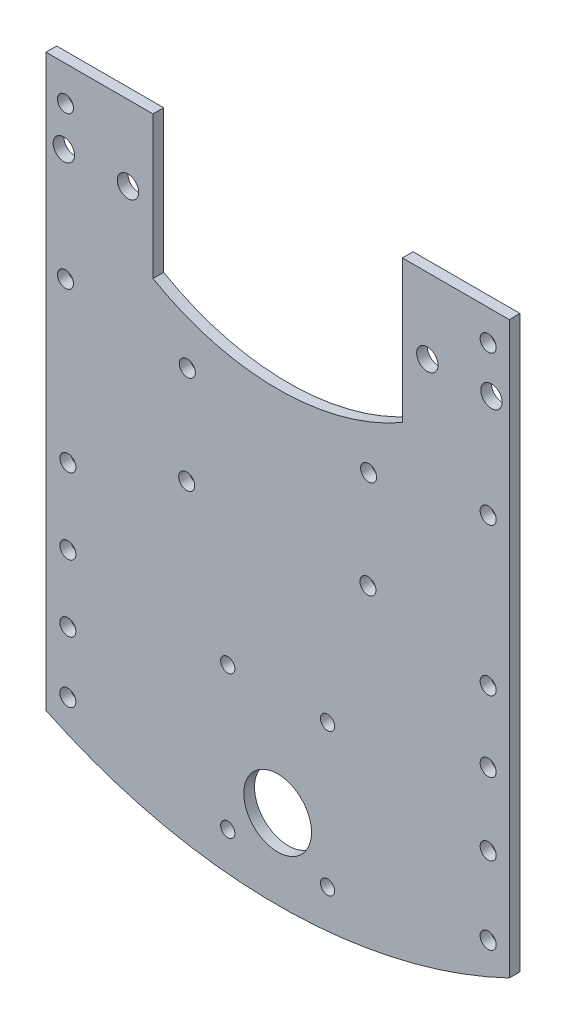
ISO-10303-21;
HEADER;
FILE_DESCRIPTION(('STEP AP214'),'2;1');
FILE_NAME('part.step','',(''),(''),'','','');
FILE_SCHEMA(('AUTOMOTIVE_DESIGN { 1 0 10303 214 1 1 1 1 }'));
ENDSEC;
DATA;
#1=APPLICATION_CONTEXT('core data for automotive mechanical design processes');
#2=APPLICATION_PROTOCOL_DEFINITION('international standard','automotive_design',2000,#1);
#3=PRODUCT_CONTEXT('',#1,'mechanical');
#4=PRODUCT('Part','Part','',(#3));
#5=PRODUCT_RELATED_PRODUCT_CATEGORY('part','',(#4));
#6=PRODUCT_DEFINITION_FORMATION('','',#4);
#7=PRODUCT_DEFINITION_CONTEXT('part definition',#1,'design');
#8=PRODUCT_DEFINITION('design','',#6,#7);
#9=PRODUCT_DEFINITION_SHAPE('','',#8);
#10=(LENGTH_UNIT() NAMED_UNIT(*) SI_UNIT(.MILLI.,.METRE.));
#11=(NAMED_UNIT(*) PLANE_ANGLE_UNIT() SI_UNIT($,.RADIAN.));
#12=(NAMED_UNIT(*) SI_UNIT($,.STERADIAN.) SOLID_ANGLE_UNIT());
#13=UNCERTAINTY_MEASURE_WITH_UNIT(LENGTH_MEASURE(1.E-05),#10,'distance_accuracy_value','');
#14=(GEOMETRIC_REPRESENTATION_CONTEXT(3) GLOBAL_UNCERTAINTY_ASSIGNED_CONTEXT((#13)) GLOBAL_UNIT_ASSIGNED_CONTEXT((#10,
#11,#12)) REPRESENTATION_CONTEXT('',''));
#15=CARTESIAN_POINT('',(0.,0.,0.));
#16=DIRECTION('',(0.,0.,1.));
#17=DIRECTION('',(1.,0.,0.));
#18=AXIS2_PLACEMENT_3D('',#15,#16,#17);
#19=CARTESIAN_POINT('',(0.82033483000224,16.841601103084,3.));
#20=DIRECTION('',(0.,0.,1.));
#21=DIRECTION('',(1.,0.,0.));
#22=AXIS2_PLACEMENT_3D('',#19,#20,#21);
#23=PLANE('',#22);
#24=CARTESIAN_POINT('',(-58.7353248928425,31.901332055439,3.));
#25=DIRECTION('',(0.,0.,1.));
#26=DIRECTION('',(1.,0.,0.));
#27=AXIS2_PLACEMENT_3D('',#24,#25,#26);
#28=CIRCLE('',#27,2.25);
#29=CARTESIAN_POINT('',(-56.4853248928425,31.901332055439,3.));
#30=VERTEX_POINT('',#29);
#31=EDGE_CURVE('E492',#30,#30,#28,.T.);
#32=ORIENTED_EDGE('',*,*,#31,.F.);
#33=EDGE_LOOP('',(#32));
#34=FACE_BOUND('',#33,.T.);
#35=CARTESIAN_POINT('',(59.8926878247371,-112.115366711053,3.));
#36=DIRECTION('',(0.,0.,1.));
#37=DIRECTION('',(1.,0.,0.));
#38=AXIS2_PLACEMENT_3D('',#35,#36,#37);
#39=CIRCLE('',#38,2.25);
#40=CARTESIAN_POINT('',(62.1426878247371,-112.115366711053,3.));
#41=VERTEX_POINT('',#40);
#42=EDGE_CURVE('E500',#41,#41,#39,.T.);
#43=ORIENTED_EDGE('',*,*,#42,.F.);
#44=EDGE_LOOP('',(#43));
#45=FACE_BOUND('',#44,.T.);
#46=CARTESIAN_POINT('',(59.8926878247371,-90.4055847690872,3.));
#47=DIRECTION('',(0.,0.,1.));
#48=DIRECTION('',(1.,0.,0.));
#49=AXIS2_PLACEMENT_3D('',#46,#47,#48);
#50=CIRCLE('',#49,2.25);
#51=CARTESIAN_POINT('',(62.1426878247371,-90.4055847690872,3.));
#52=VERTEX_POINT('',#51);
#53=EDGE_CURVE('E503',#52,#52,#50,.T.);
#54=ORIENTED_EDGE('',*,*,#53,.F.);
#55=EDGE_LOOP('',(#54));
#56=FACE_BOUND('',#55,.T.);
#57=CARTESIAN_POINT('',(59.8926878247371,-70.121992881703,3.));
#58=DIRECTION('',(0.,0.,1.));
#59=DIRECTION('',(1.,0.,0.));
#60=AXIS2_PLACEMENT_3D('',#57,#58,#59);
#61=CIRCLE('',#60,2.25);
#62=CARTESIAN_POINT('',(62.1426878247371,-70.121992881703,3.));
#63=VERTEX_POINT('',#62);
#64=EDGE_CURVE('E506',#63,#63,#61,.T.);
#65=ORIENTED_EDGE('',*,*,#64,.F.);
#66=EDGE_LOOP('',(#65));
#67=FACE_BOUND('',#66,.T.);
#68=CARTESIAN_POINT('',(-58.7353248928425,-10.7596293906167,3.));
#69=DIRECTION('',(0.,0.,1.));
#70=DIRECTION('',(1.,0.,0.));
#71=AXIS2_PLACEMENT_3D('',#68,#69,#70);
#72=CIRCLE('',#71,2.24999999999999);
#73=CARTESIAN_POINT('',(-56.4853248928425,-10.7596293906167,3.));
#74=VERTEX_POINT('',#73);
#75=EDGE_CURVE('E488',#74,#74,#72,.T.);
#76=ORIENTED_EDGE('',*,*,#75,.F.);
#77=EDGE_LOOP('',(#76));
#78=FACE_BOUND('',#77,.T.);
#79=CARTESIAN_POINT('',(-58.0507536666432,-55.0285686848329,3.));
#80=DIRECTION('',(0.,0.,1.));
#81=DIRECTION('',(1.,0.,0.));
#82=AXIS2_PLACEMENT_3D('',#79,#80,#81);
#83=CIRCLE('',#82,2.24999999999999);
#84=CARTESIAN_POINT('',(-55.8007536666432,-55.0285686848329,3.));
#85=VERTEX_POINT('',#84);
#86=EDGE_CURVE('E491',#85,#85,#83,.T.);
#87=ORIENTED_EDGE('',*,*,#86,.F.);
#88=EDGE_LOOP('',(#87));
#89=FACE_BOUND('',#88,.T.);
#90=CARTESIAN_POINT('',(-58.0507536666432,-76.2502766970087,3.));
#91=DIRECTION('',(0.,0.,1.));
#92=DIRECTION('',(1.,0.,0.));
#93=AXIS2_PLACEMENT_3D('',#90,#91,#92);
#94=CIRCLE('',#93,2.25);
#95=CARTESIAN_POINT('',(-55.8007536666432,-76.2502766970087,3.));
#96=VERTEX_POINT('',#95);
#97=EDGE_CURVE('E495',#96,#96,#94,.T.);
#98=ORIENTED_EDGE('',*,*,#97,.F.);
#99=EDGE_LOOP('',(#98));
#100=FACE_BOUND('',#99,.T.);
#101=CARTESIAN_POINT('',(-58.0507536666432,-94.9618902131206,3.));
#102=DIRECTION('',(0.,0.,1.));
#103=DIRECTION('',(1.,0.,0.));
#104=AXIS2_PLACEMENT_3D('',#101,#102,#103);
#105=CIRCLE('',#104,2.24999999999999);
#106=CARTESIAN_POINT('',(-55.8007536666432,-94.9618902131206,3.));
#107=VERTEX_POINT('',#106);
#108=EDGE_CURVE('E487',#107,#107,#105,.T.);
#109=ORIENTED_EDGE('',*,*,#108,.F.);
#110=EDGE_LOOP('',(#109));
#111=FACE_BOUND('',#110,.T.);
#112=CARTESIAN_POINT('',(59.8926878247371,-50.255835401353,3.));
#113=DIRECTION('',(0.,0.,1.));
#114=DIRECTION('',(1.,0.,0.));
#115=AXIS2_PLACEMENT_3D('',#112,#113,#114);
#116=CIRCLE('',#115,2.25);
#117=CARTESIAN_POINT('',(62.1426878247371,-50.255835401353,3.));
#118=VERTEX_POINT('',#117);
#119=EDGE_CURVE('E412',#118,#118,#116,.T.);
#120=ORIENTED_EDGE('',*,*,#119,.F.);
#121=EDGE_LOOP('',(#120));
#122=FACE_BOUND('',#121,.T.);
#123=CARTESIAN_POINT('',(59.8926878247371,-8.82591075219494,3.));
#124=DIRECTION('',(0.,0.,1.));
#125=DIRECTION('',(1.,0.,0.));
#126=AXIS2_PLACEMENT_3D('',#123,#124,#125);
#127=CIRCLE('',#126,2.25);
#128=CARTESIAN_POINT('',(62.1426878247371,-8.82591075219494,3.));
#129=VERTEX_POINT('',#128);
#130=EDGE_CURVE('E514',#129,#129,#127,.T.);
#131=ORIENTED_EDGE('',*,*,#130,.F.);
#132=EDGE_LOOP('',(#131));
#133=FACE_BOUND('',#132,.T.);
#134=CARTESIAN_POINT('',(59.8926878247371,33.0331101704914,3.));
#135=DIRECTION('',(0.,0.,1.));
#136=DIRECTION('',(1.,0.,0.));
#137=AXIS2_PLACEMENT_3D('',#134,#135,#136);
#138=CIRCLE('',#137,2.25);
#139=CARTESIAN_POINT('',(62.1426878247371,33.0331101704914,3.));
#140=VERTEX_POINT('',#139);
#141=EDGE_CURVE('E511',#140,#140,#138,.T.);
#142=ORIENTED_EDGE('',*,*,#141,.F.);
#143=EDGE_LOOP('',(#142));
#144=FACE_BOUND('',#143,.T.);
#145=CARTESIAN_POINT('',(-58.0507536666432,-112.076170868101,3.));
#146=DIRECTION('',(0.,0.,1.));
#147=DIRECTION('',(1.,0.,0.));
#148=AXIS2_PLACEMENT_3D('',#145,#146,#147);
#149=CIRCLE('',#148,2.24999999999999);
#150=CARTESIAN_POINT('',(-55.8007536666432,-112.076170868101,3.));
#151=VERTEX_POINT('',#150);
#152=EDGE_CURVE('E168',#151,#151,#149,.T.);
#153=ORIENTED_EDGE('',*,*,#152,.F.);
#154=EDGE_LOOP('',(#153));
#155=FACE_BOUND('',#154,.T.);
#156=CARTESIAN_POINT('',(-24.6990644063407,-42.8702786135747,3.));
#157=DIRECTION('',(0.,0.,1.));
#158=DIRECTION('',(1.,0.,0.));
#159=AXIS2_PLACEMENT_3D('',#156,#157,#158);
#160=CIRCLE('',#159,2.25);
#161=CARTESIAN_POINT('',(-22.4490644063407,-42.8702786135747,3.));
#162=VERTEX_POINT('',#161);
#163=EDGE_CURVE('E203',#162,#162,#160,.F.);
#164=ORIENTED_EDGE('',*,*,#163,.T.);
#165=EDGE_LOOP('',(#164));
#166=FACE_BOUND('',#165,.T.);
#167=CARTESIAN_POINT('',(-24.52945484201,-15.2902786135747,3.));
#168=DIRECTION('',(0.,0.,1.));
#169=DIRECTION('',(1.,0.,0.));
#170=AXIS2_PLACEMENT_3D('',#167,#168,#169);
#171=CIRCLE('',#170,2.25);
#172=CARTESIAN_POINT('',(-22.27945484201,-15.2902786135747,3.));
#173=VERTEX_POINT('',#172);
#174=EDGE_CURVE('E211',#173,#173,#171,.F.);
#175=ORIENTED_EDGE('',*,*,#174,.T.);
#176=EDGE_LOOP('',(#175));
#177=FACE_BOUND('',#176,.T.);
#178=CARTESIAN_POINT('',(26.3397340663453,-15.2902786135748,3.));
#179=DIRECTION('',(0.,0.,1.));
#180=DIRECTION('',(1.,0.,0.));
#181=AXIS2_PLACEMENT_3D('',#178,#179,#180);
#182=CIRCLE('',#181,2.25);
#183=CARTESIAN_POINT('',(28.5897340663453,-15.2902786135748,3.));
#184=VERTEX_POINT('',#183);
#185=EDGE_CURVE('E218',#184,#184,#182,.F.);
#186=ORIENTED_EDGE('',*,*,#185,.T.);
#187=EDGE_LOOP('',(#186));
#188=FACE_BOUND('',#187,.T.);
#189=CARTESIAN_POINT('',(26.1701245020146,-42.8702786135748,3.));
#190=DIRECTION('',(0.,0.,1.));
#191=DIRECTION('',(1.,0.,0.));
#192=AXIS2_PLACEMENT_3D('',#189,#190,#191);
#193=CIRCLE('',#192,2.25);
#194=CARTESIAN_POINT('',(28.4201245020146,-42.8702786135748,3.));
#195=VERTEX_POINT('',#194);
#196=EDGE_CURVE('E217',#195,#195,#193,.F.);
#197=ORIENTED_EDGE('',*,*,#196,.T.);
#198=EDGE_LOOP('',(#197));
#199=FACE_BOUND('',#198,.T.);
#200=CARTESIAN_POINT('',(-13.1796651699263,-121.721678977984,3.));
#201=DIRECTION('',(0.,0.,1.));
#202=DIRECTION('',(1.,0.,0.));
#203=AXIS2_PLACEMENT_3D('',#200,#201,#202);
#204=CIRCLE('',#203,2.);
#205=CARTESIAN_POINT('',(-11.1796651699263,-121.721678977984,3.));
#206=VERTEX_POINT('',#205);
#207=EDGE_CURVE('E233',#206,#206,#204,.F.);
#208=ORIENTED_EDGE('',*,*,#207,.T.);
#209=EDGE_LOOP('',(#208));
#210=FACE_BOUND('',#209,.T.);
#211=CARTESIAN_POINT('',(-13.1796651699439,-81.7216789779836,3.));
#212=DIRECTION('',(0.,0.,1.));
#213=DIRECTION('',(1.,0.,0.));
#214=AXIS2_PLACEMENT_3D('',#211,#212,#213);
#215=CIRCLE('',#214,2.);
#216=CARTESIAN_POINT('',(-11.1796651699439,-81.7216789779836,3.));
#217=VERTEX_POINT('',#216);
#218=EDGE_CURVE('E226',#217,#217,#215,.F.);
#219=ORIENTED_EDGE('',*,*,#218,.T.);
#220=EDGE_LOOP('',(#219));
#221=FACE_BOUND('',#220,.T.);
#222=CARTESIAN_POINT('',(14.8203348300561,-81.7216789779713,3.));
#223=DIRECTION('',(0.,0.,1.));
#224=DIRECTION('',(1.,0.,0.));
#225=AXIS2_PLACEMENT_3D('',#222,#223,#224);
#226=CIRCLE('',#225,2.);
#227=CARTESIAN_POINT('',(16.8203348300561,-81.7216789779713,3.));
#228=VERTEX_POINT('',#227);
#229=EDGE_CURVE('E225',#228,#228,#226,.F.);
#230=ORIENTED_EDGE('',*,*,#229,.T.);
#231=EDGE_LOOP('',(#230));
#232=FACE_BOUND('',#231,.T.);
#233=CARTESIAN_POINT('',(14.8203348300737,-121.721678977971,3.));
#234=DIRECTION('',(0.,0.,1.));
#235=DIRECTION('',(1.,0.,0.));
#236=AXIS2_PLACEMENT_3D('',#233,#234,#235);
#237=CIRCLE('',#236,2.);
#238=CARTESIAN_POINT('',(16.8203348300737,-121.721678977971,3.));
#239=VERTEX_POINT('',#238);
#240=EDGE_CURVE('E242',#239,#239,#237,.F.);
#241=ORIENTED_EDGE('',*,*,#240,.T.);
#242=EDGE_LOOP('',(#241));
#243=FACE_BOUND('',#242,.T.);
#244=CARTESIAN_POINT('',(0.820334830002261,-110.721678977963,3.));
#245=DIRECTION('',(0.,0.,1.));
#246=DIRECTION('',(1.,0.,0.));
#247=AXIS2_PLACEMENT_3D('',#244,#245,#246);
#248=CIRCLE('',#247,9.49999999999999);
#249=CARTESIAN_POINT('',(10.3203348300023,-110.721678977963,3.));
#250=VERTEX_POINT('',#249);
#251=EDGE_CURVE('E163',#250,#250,#248,.T.);
#252=ORIENTED_EDGE('',*,*,#251,.F.);
#253=EDGE_LOOP('',(#252));
#254=FACE_BOUND('',#253,.T.);
#255=CARTESIAN_POINT('',(-59.1796651699977,20.5544747081712,3.));
#256=DIRECTION('',(0.,0.,1.));
#257=DIRECTION('',(-1.,0.,0.));
#258=AXIS2_PLACEMENT_3D('',#255,#256,#257);
#259=CIRCLE('',#258,3.);
#260=CARTESIAN_POINT('',(-62.1796651699977,20.5544747081712,3.));
#261=VERTEX_POINT('',#260);
#262=EDGE_CURVE('E253',#261,#261,#259,.T.);
#263=ORIENTED_EDGE('',*,*,#262,.F.);
#264=EDGE_LOOP('',(#263));
#265=FACE_BOUND('',#264,.T.);
#266=CARTESIAN_POINT('',(60.8203348300023,20.5544747081712,3.));
#267=DIRECTION('',(0.,0.,1.));
#268=DIRECTION('',(1.,0.,0.));
#269=AXIS2_PLACEMENT_3D('',#266,#267,#268);
#270=CIRCLE('',#269,3.00000000000001);
#271=CARTESIAN_POINT('',(63.8203348300023,20.5544747081712,3.));
#272=VERTEX_POINT('',#271);
#273=EDGE_CURVE('E136',#272,#272,#270,.T.);
#274=ORIENTED_EDGE('',*,*,#273,.F.);
#275=EDGE_LOOP('',(#274));
#276=FACE_BOUND('',#275,.T.);
#277=DIRECTION('',(-1.,0.,0.));
#278=VECTOR('',#277,1.);
#279=CARTESIAN_POINT('',(-34.1796651699977,41.6565427571263,3.));
#280=LINE('',#279,#278);
#281=CARTESIAN_POINT('',(-34.1796651699977,41.6565427571263,3.));
#282=VERTEX_POINT('',#281);
#283=CARTESIAN_POINT('',(-64.1796651699977,41.6565427571263,3.));
#284=VERTEX_POINT('',#283);
#285=EDGE_CURVE('E147',#282,#284,#280,.T.);
#286=ORIENTED_EDGE('',*,*,#285,.T.);
#287=DIRECTION('',(0.,-1.,0.));
#288=VECTOR('',#287,1.);
#289=CARTESIAN_POINT('',(-64.1796651699977,41.6565427571263,3.));
#290=LINE('',#289,#288);
#291=CARTESIAN_POINT('',(-64.1796651699978,-118.343457242874,3.));
#292=VERTEX_POINT('',#291);
#293=EDGE_CURVE('E95',#284,#292,#290,.T.);
#294=ORIENTED_EDGE('',*,*,#293,.T.);
#295=CARTESIAN_POINT('',(0.82033483000224,16.841601103084,3.));
#296=DIRECTION('',(0.,0.,1.));
#297=DIRECTION('',(1.,0.,0.));
#298=AXIS2_PLACEMENT_3D('',#295,#296,#297);
#299=CIRCLE('',#298,150.);
#300=CARTESIAN_POINT('',(65.8203348300023,-118.343457242874,3.));
#301=VERTEX_POINT('',#300);
#302=EDGE_CURVE('E271',#292,#301,#299,.T.);
#303=ORIENTED_EDGE('',*,*,#302,.T.);
#304=DIRECTION('',(0.,1.,0.));
#305=VECTOR('',#304,1.);
#306=CARTESIAN_POINT('',(65.8203348300023,-118.343457242874,3.));
#307=LINE('',#306,#305);
#308=CARTESIAN_POINT('',(65.8203348300023,41.6565427571263,3.));
#309=VERTEX_POINT('',#308);
#310=EDGE_CURVE('E273',#301,#309,#307,.T.);
#311=ORIENTED_EDGE('',*,*,#310,.T.);
#312=DIRECTION('',(-1.,0.,0.));
#313=VECTOR('',#312,1.);
#314=CARTESIAN_POINT('',(65.8203348300023,41.6565427571263,3.));
#315=LINE('',#314,#313);
#316=CARTESIAN_POINT('',(35.8203348300023,41.6565427571263,3.));
#317=VERTEX_POINT('',#316);
#318=EDGE_CURVE('E114',#309,#317,#315,.T.);
#319=ORIENTED_EDGE('',*,*,#318,.T.);
#320=DIRECTION('',(0.,-1.,0.));
#321=VECTOR('',#320,1.);
#322=CARTESIAN_POINT('',(35.8203348300023,41.6565427571263,3.));
#323=LINE('',#322,#321);
#324=CARTESIAN_POINT('',(35.8203348300023,1.65654275712631,3.));
#325=VERTEX_POINT('',#324);
#326=EDGE_CURVE('E108',#317,#325,#323,.T.);
#327=ORIENTED_EDGE('',*,*,#326,.T.);
#328=CARTESIAN_POINT('',(0.82033483000224,62.278321022037,3.));
#329=DIRECTION('',(0.,0.,-1.));
#330=DIRECTION('',(1.,0.,0.));
#331=AXIS2_PLACEMENT_3D('',#328,#329,#330);
#332=CIRCLE('',#331,70.);
#333=CARTESIAN_POINT('',(-34.1796651699977,1.65654275712625,3.));
#334=VERTEX_POINT('',#333);
#335=EDGE_CURVE('E112',#325,#334,#332,.T.);
#336=ORIENTED_EDGE('',*,*,#335,.T.);
#337=DIRECTION('',(0.,1.,0.));
#338=VECTOR('',#337,1.);
#339=CARTESIAN_POINT('',(-34.1796651699977,1.65654275712625,3.));
#340=LINE('',#339,#338);
#341=EDGE_CURVE('E52',#334,#282,#340,.T.);
#342=ORIENTED_EDGE('',*,*,#341,.T.);
#343=EDGE_LOOP('',(#286,#294,#303,#311,#319,#327,#336,#342));
#344=FACE_BOUND('',#343,.T.);
#345=CARTESIAN_POINT('',(42.8203348300023,20.5544747081712,3.));
#346=DIRECTION('',(0.,0.,1.));
#347=DIRECTION('',(1.,0.,0.));
#348=AXIS2_PLACEMENT_3D('',#345,#346,#347);
#349=CIRCLE('',#348,2.99999999999999);
#350=CARTESIAN_POINT('',(45.8203348300023,20.5544747081712,3.));
#351=VERTEX_POINT('',#350);
#352=EDGE_CURVE('E259',#351,#351,#349,.T.);
#353=ORIENTED_EDGE('',*,*,#352,.F.);
#354=EDGE_LOOP('',(#353));
#355=FACE_BOUND('',#354,.T.);
#356=CARTESIAN_POINT('',(-41.1796651699977,20.5544747081712,3.));
#357=DIRECTION('',(0.,0.,1.));
#358=DIRECTION('',(-1.,0.,0.));
#359=AXIS2_PLACEMENT_3D('',#356,#357,#358);
#360=CIRCLE('',#359,2.99999999999999);
#361=CARTESIAN_POINT('',(-44.1796651699977,20.5544747081712,3.));
#362=VERTEX_POINT('',#361);
#363=EDGE_CURVE('E247',#362,#362,#360,.T.);
#364=ORIENTED_EDGE('',*,*,#363,.F.);
#365=EDGE_LOOP('',(#364));
#366=FACE_BOUND('',#365,.T.);
#367=ADVANCED_FACE('F33',(#34,#45,#56,#67,#78,#89,#100,#111,#122,#133,#144,#155,#166,#177,#188,
#199,#210,#221,#232,#243,#254,#265,#276,#344,#355,#366),#23,.T.);
#368=CARTESIAN_POINT('',(0.82033483000224,16.841601103084,0.));
#369=DIRECTION('',(0.,0.,1.));
#370=DIRECTION('',(1.,0.,0.));
#371=AXIS2_PLACEMENT_3D('',#368,#369,#370);
#372=PLANE('',#371);
#373=CARTESIAN_POINT('',(-58.7353248928425,31.901332055439,0.));
#374=DIRECTION('',(0.,0.,1.));
#375=DIRECTION('',(1.,0.,0.));
#376=AXIS2_PLACEMENT_3D('',#373,#374,#375);
#377=CIRCLE('',#376,2.25);
#378=CARTESIAN_POINT('',(-56.4853248928425,31.901332055439,0.));
#379=VERTEX_POINT('',#378);
#380=EDGE_CURVE('E37',#379,#379,#377,.T.);
#381=ORIENTED_EDGE('',*,*,#380,.T.);
#382=EDGE_LOOP('',(#381));
#383=FACE_BOUND('',#382,.T.);
#384=CARTESIAN_POINT('',(59.8926878247371,-112.115366711053,0.));
#385=DIRECTION('',(0.,0.,1.));
#386=DIRECTION('',(1.,0.,0.));
#387=AXIS2_PLACEMENT_3D('',#384,#385,#386);
#388=CIRCLE('',#387,2.25);
#389=CARTESIAN_POINT('',(62.1426878247371,-112.115366711053,0.));
#390=VERTEX_POINT('',#389);
#391=EDGE_CURVE('E194',#390,#390,#388,.T.);
#392=ORIENTED_EDGE('',*,*,#391,.T.);
#393=EDGE_LOOP('',(#392));
#394=FACE_BOUND('',#393,.T.);
#395=CARTESIAN_POINT('',(59.8926878247371,-90.4055847690872,0.));
#396=DIRECTION('',(0.,0.,1.));
#397=DIRECTION('',(1.,0.,0.));
#398=AXIS2_PLACEMENT_3D('',#395,#396,#397);
#399=CIRCLE('',#398,2.25);
#400=CARTESIAN_POINT('',(62.1426878247371,-90.4055847690872,0.));
#401=VERTEX_POINT('',#400);
#402=EDGE_CURVE('E192',#401,#401,#399,.T.);
#403=ORIENTED_EDGE('',*,*,#402,.T.);
#404=EDGE_LOOP('',(#403));
#405=FACE_BOUND('',#404,.T.);
#406=CARTESIAN_POINT('',(59.8926878247371,-70.121992881703,0.));
#407=DIRECTION('',(0.,0.,1.));
#408=DIRECTION('',(1.,0.,0.));
#409=AXIS2_PLACEMENT_3D('',#406,#407,#408);
#410=CIRCLE('',#409,2.25);
#411=CARTESIAN_POINT('',(62.1426878247371,-70.121992881703,0.));
#412=VERTEX_POINT('',#411);
#413=EDGE_CURVE('E189',#412,#412,#410,.T.);
#414=ORIENTED_EDGE('',*,*,#413,.T.);
#415=EDGE_LOOP('',(#414));
#416=FACE_BOUND('',#415,.T.);
#417=CARTESIAN_POINT('',(-58.7353248928425,-10.7596293906167,0.));
#418=DIRECTION('',(0.,0.,1.));
#419=DIRECTION('',(1.,0.,0.));
#420=AXIS2_PLACEMENT_3D('',#417,#418,#419);
#421=CIRCLE('',#420,2.24999999999999);
#422=CARTESIAN_POINT('',(-56.4853248928425,-10.7596293906167,0.));
#423=VERTEX_POINT('',#422);
#424=EDGE_CURVE('E186',#423,#423,#421,.T.);
#425=ORIENTED_EDGE('',*,*,#424,.T.);
#426=EDGE_LOOP('',(#425));
#427=FACE_BOUND('',#426,.T.);
#428=CARTESIAN_POINT('',(-58.0507536666432,-55.0285686848329,0.));
#429=DIRECTION('',(0.,0.,1.));
#430=DIRECTION('',(1.,0.,0.));
#431=AXIS2_PLACEMENT_3D('',#428,#429,#430);
#432=CIRCLE('',#431,2.24999999999999);
#433=CARTESIAN_POINT('',(-55.8007536666432,-55.0285686848329,0.));
#434=VERTEX_POINT('',#433);
#435=EDGE_CURVE('E183',#434,#434,#432,.T.);
#436=ORIENTED_EDGE('',*,*,#435,.T.);
#437=EDGE_LOOP('',(#436));
#438=FACE_BOUND('',#437,.T.);
#439=CARTESIAN_POINT('',(-58.0507536666432,-76.2502766970087,0.));
#440=DIRECTION('',(0.,0.,1.));
#441=DIRECTION('',(1.,0.,0.));
#442=AXIS2_PLACEMENT_3D('',#439,#440,#441);
#443=CIRCLE('',#442,2.25);
#444=CARTESIAN_POINT('',(-55.8007536666432,-76.2502766970087,0.));
#445=VERTEX_POINT('',#444);
#446=EDGE_CURVE('E180',#445,#445,#443,.T.);
#447=ORIENTED_EDGE('',*,*,#446,.T.);
#448=EDGE_LOOP('',(#447));
#449=FACE_BOUND('',#448,.T.);
#450=CARTESIAN_POINT('',(-58.0507536666432,-94.9618902131206,0.));
#451=DIRECTION('',(0.,0.,1.));
#452=DIRECTION('',(1.,0.,0.));
#453=AXIS2_PLACEMENT_3D('',#450,#451,#452);
#454=CIRCLE('',#453,2.24999999999999);
#455=CARTESIAN_POINT('',(-55.8007536666432,-94.9618902131206,0.));
#456=VERTEX_POINT('',#455);
#457=EDGE_CURVE('E177',#456,#456,#454,.T.);
#458=ORIENTED_EDGE('',*,*,#457,.T.);
#459=EDGE_LOOP('',(#458));
#460=FACE_BOUND('',#459,.T.);
#461=CARTESIAN_POINT('',(59.8926878247371,-50.255835401353,0.));
#462=DIRECTION('',(0.,0.,1.));
#463=DIRECTION('',(1.,0.,0.));
#464=AXIS2_PLACEMENT_3D('',#461,#462,#463);
#465=CIRCLE('',#464,2.25);
#466=CARTESIAN_POINT('',(62.1426878247371,-50.255835401353,0.));
#467=VERTEX_POINT('',#466);
#468=EDGE_CURVE('E174',#467,#467,#465,.T.);
#469=ORIENTED_EDGE('',*,*,#468,.T.);
#470=EDGE_LOOP('',(#469));
#471=FACE_BOUND('',#470,.T.);
#472=CARTESIAN_POINT('',(59.8926878247371,-8.82591075219494,0.));
#473=DIRECTION('',(0.,0.,1.));
#474=DIRECTION('',(1.,0.,0.));
#475=AXIS2_PLACEMENT_3D('',#472,#473,#474);
#476=CIRCLE('',#475,2.25);
#477=CARTESIAN_POINT('',(62.1426878247371,-8.82591075219494,0.));
#478=VERTEX_POINT('',#477);
#479=EDGE_CURVE('E171',#478,#478,#476,.T.);
#480=ORIENTED_EDGE('',*,*,#479,.T.);
#481=EDGE_LOOP('',(#480));
#482=FACE_BOUND('',#481,.T.);
#483=CARTESIAN_POINT('',(59.8926878247371,33.0331101704914,0.));
#484=DIRECTION('',(0.,0.,1.));
#485=DIRECTION('',(1.,0.,0.));
#486=AXIS2_PLACEMENT_3D('',#483,#484,#485);
#487=CIRCLE('',#486,2.25);
#488=CARTESIAN_POINT('',(62.1426878247371,33.0331101704914,0.));
#489=VERTEX_POINT('',#488);
#490=EDGE_CURVE('E167',#489,#489,#487,.T.);
#491=ORIENTED_EDGE('',*,*,#490,.T.);
#492=EDGE_LOOP('',(#491));
#493=FACE_BOUND('',#492,.T.);
#494=CARTESIAN_POINT('',(-58.0507536666432,-112.076170868101,0.));
#495=DIRECTION('',(0.,0.,1.));
#496=DIRECTION('',(1.,0.,0.));
#497=AXIS2_PLACEMENT_3D('',#494,#495,#496);
#498=CIRCLE('',#497,2.24999999999999);
#499=CARTESIAN_POINT('',(-55.8007536666432,-112.076170868101,0.));
#500=VERTEX_POINT('',#499);
#501=EDGE_CURVE('E164',#500,#500,#498,.T.);
#502=ORIENTED_EDGE('',*,*,#501,.T.);
#503=EDGE_LOOP('',(#502));
#504=FACE_BOUND('',#503,.T.);
#505=CARTESIAN_POINT('',(-24.6990644063407,-42.8702786135747,0.));
#506=DIRECTION('',(0.,0.,-1.));
#507=DIRECTION('',(-1.,0.,0.));
#508=AXIS2_PLACEMENT_3D('',#505,#506,#507);
#509=CIRCLE('',#508,2.25);
#510=CARTESIAN_POINT('',(-26.9490644063407,-42.8702786135747,0.));
#511=VERTEX_POINT('',#510);
#512=EDGE_CURVE('E199',#511,#511,#509,.T.);
#513=ORIENTED_EDGE('',*,*,#512,.F.);
#514=EDGE_LOOP('',(#513));
#515=FACE_BOUND('',#514,.T.);
#516=CARTESIAN_POINT('',(-24.52945484201,-15.2902786135747,0.));
#517=DIRECTION('',(0.,0.,-1.));
#518=DIRECTION('',(-1.,0.,0.));
#519=AXIS2_PLACEMENT_3D('',#516,#517,#518);
#520=CIRCLE('',#519,2.25);
#521=CARTESIAN_POINT('',(-26.77945484201,-15.2902786135747,0.));
#522=VERTEX_POINT('',#521);
#523=EDGE_CURVE('E208',#522,#522,#520,.T.);
#524=ORIENTED_EDGE('',*,*,#523,.F.);
#525=EDGE_LOOP('',(#524));
#526=FACE_BOUND('',#525,.T.);
#527=CARTESIAN_POINT('',(26.3397340663453,-15.2902786135748,0.));
#528=DIRECTION('',(0.,0.,-1.));
#529=DIRECTION('',(-1.,0.,0.));
#530=AXIS2_PLACEMENT_3D('',#527,#528,#529);
#531=CIRCLE('',#530,2.25);
#532=CARTESIAN_POINT('',(24.0897340663453,-15.2902786135748,0.));
#533=VERTEX_POINT('',#532);
#534=EDGE_CURVE('E429',#533,#533,#531,.T.);
#535=ORIENTED_EDGE('',*,*,#534,.F.);
#536=EDGE_LOOP('',(#535));
#537=FACE_BOUND('',#536,.T.);
#538=CARTESIAN_POINT('',(26.1701245020146,-42.8702786135748,0.));
#539=DIRECTION('',(0.,0.,-1.));
#540=DIRECTION('',(-1.,0.,0.));
#541=AXIS2_PLACEMENT_3D('',#538,#539,#540);
#542=CIRCLE('',#541,2.25);
#543=CARTESIAN_POINT('',(23.9201245020146,-42.8702786135748,0.));
#544=VERTEX_POINT('',#543);
#545=EDGE_CURVE('E214',#544,#544,#542,.T.);
#546=ORIENTED_EDGE('',*,*,#545,.F.);
#547=EDGE_LOOP('',(#546));
#548=FACE_BOUND('',#547,.T.);
#549=CARTESIAN_POINT('',(-13.1796651699263,-121.721678977984,0.));
#550=DIRECTION('',(0.,0.,-1.));
#551=DIRECTION('',(-1.,0.,0.));
#552=AXIS2_PLACEMENT_3D('',#549,#550,#551);
#553=CIRCLE('',#552,2.);
#554=CARTESIAN_POINT('',(-15.1796651699263,-121.721678977984,0.));
#555=VERTEX_POINT('',#554);
#556=EDGE_CURVE('E221',#555,#555,#553,.T.);
#557=ORIENTED_EDGE('',*,*,#556,.F.);
#558=EDGE_LOOP('',(#557));
#559=FACE_BOUND('',#558,.T.);
#560=CARTESIAN_POINT('',(-13.1796651699439,-81.7216789779836,0.));
#561=DIRECTION('',(0.,0.,-1.));
#562=DIRECTION('',(-1.,0.,0.));
#563=AXIS2_PLACEMENT_3D('',#560,#561,#562);
#564=CIRCLE('',#563,2.);
#565=CARTESIAN_POINT('',(-15.1796651699439,-81.7216789779836,0.));
#566=VERTEX_POINT('',#565);
#567=EDGE_CURVE('E230',#566,#566,#564,.T.);
#568=ORIENTED_EDGE('',*,*,#567,.F.);
#569=EDGE_LOOP('',(#568));
#570=FACE_BOUND('',#569,.T.);
#571=CARTESIAN_POINT('',(14.8203348300561,-81.7216789779713,0.));
#572=DIRECTION('',(0.,0.,-1.));
#573=DIRECTION('',(-1.,0.,0.));
#574=AXIS2_PLACEMENT_3D('',#571,#572,#573);
#575=CIRCLE('',#574,2.);
#576=CARTESIAN_POINT('',(12.8203348300561,-81.7216789779713,0.));
#577=VERTEX_POINT('',#576);
#578=EDGE_CURVE('E222',#577,#577,#575,.T.);
#579=ORIENTED_EDGE('',*,*,#578,.F.);
#580=EDGE_LOOP('',(#579));
#581=FACE_BOUND('',#580,.T.);
#582=CARTESIAN_POINT('',(14.8203348300737,-121.721678977971,0.));
#583=DIRECTION('',(0.,0.,-1.));
#584=DIRECTION('',(-1.,0.,0.));
#585=AXIS2_PLACEMENT_3D('',#582,#583,#584);
#586=CIRCLE('',#585,2.);
#587=CARTESIAN_POINT('',(12.8203348300737,-121.721678977971,0.));
#588=VERTEX_POINT('',#587);
#589=EDGE_CURVE('E229',#588,#588,#586,.T.);
#590=ORIENTED_EDGE('',*,*,#589,.F.);
#591=EDGE_LOOP('',(#590));
#592=FACE_BOUND('',#591,.T.);
#593=CARTESIAN_POINT('',(0.820334830002261,-110.721678977963,0.));
#594=DIRECTION('',(0.,0.,1.));
#595=DIRECTION('',(1.,0.,0.));
#596=AXIS2_PLACEMENT_3D('',#593,#594,#595);
#597=CIRCLE('',#596,9.49999999999999);
#598=CARTESIAN_POINT('',(10.3203348300023,-110.721678977963,0.));
#599=VERTEX_POINT('',#598);
#600=EDGE_CURVE('E159',#599,#599,#597,.T.);
#601=ORIENTED_EDGE('',*,*,#600,.T.);
#602=EDGE_LOOP('',(#601));
#603=FACE_BOUND('',#602,.T.);
#604=DIRECTION('',(-1.,0.,0.));
#605=VECTOR('',#604,1.);
#606=CARTESIAN_POINT('',(-34.1796651699977,41.6565427571263,0.));
#607=LINE('',#606,#605);
#608=CARTESIAN_POINT('',(-34.1796651699977,41.6565427571263,0.));
#609=VERTEX_POINT('',#608);
#610=CARTESIAN_POINT('',(-64.1796651699977,41.6565427571263,0.));
#611=VERTEX_POINT('',#610);
#612=EDGE_CURVE('E132',#609,#611,#607,.T.);
#613=ORIENTED_EDGE('',*,*,#612,.F.);
#614=DIRECTION('',(0.,1.,0.));
#615=VECTOR('',#614,1.);
#616=CARTESIAN_POINT('',(-34.1796651699977,1.65654275712625,0.));
#617=LINE('',#616,#615);
#618=CARTESIAN_POINT('',(-34.1796651699977,1.65654275712625,0.));
#619=VERTEX_POINT('',#618);
#620=EDGE_CURVE('E87',#619,#609,#617,.T.);
#621=ORIENTED_EDGE('',*,*,#620,.F.);
#622=CARTESIAN_POINT('',(0.82033483000224,62.278321022037,0.));
#623=DIRECTION('',(0.,0.,-1.));
#624=DIRECTION('',(1.,0.,0.));
#625=AXIS2_PLACEMENT_3D('',#622,#623,#624);
#626=CIRCLE('',#625,70.);
#627=CARTESIAN_POINT('',(35.8203348300023,1.65654275712631,0.));
#628=VERTEX_POINT('',#627);
#629=EDGE_CURVE('E81',#628,#619,#626,.T.);
#630=ORIENTED_EDGE('',*,*,#629,.F.);
#631=DIRECTION('',(0.,-1.,0.));
#632=VECTOR('',#631,1.);
#633=CARTESIAN_POINT('',(35.8203348300023,41.6565427571263,0.));
#634=LINE('',#633,#632);
#635=CARTESIAN_POINT('',(35.8203348300023,41.6565427571263,0.));
#636=VERTEX_POINT('',#635);
#637=EDGE_CURVE('E122',#636,#628,#634,.T.);
#638=ORIENTED_EDGE('',*,*,#637,.F.);
#639=DIRECTION('',(-1.,0.,0.));
#640=VECTOR('',#639,1.);
#641=CARTESIAN_POINT('',(65.8203348300023,41.6565427571263,0.));
#642=LINE('',#641,#640);
#643=CARTESIAN_POINT('',(65.8203348300023,41.6565427571263,0.));
#644=VERTEX_POINT('',#643);
#645=EDGE_CURVE('E142',#644,#636,#642,.T.);
#646=ORIENTED_EDGE('',*,*,#645,.F.);
#647=DIRECTION('',(0.,1.,0.));
#648=VECTOR('',#647,1.);
#649=CARTESIAN_POINT('',(65.8203348300023,-118.343457242874,0.));
#650=LINE('',#649,#648);
#651=CARTESIAN_POINT('',(65.8203348300023,-118.343457242874,0.));
#652=VERTEX_POINT('',#651);
#653=EDGE_CURVE('E140',#652,#644,#650,.T.);
#654=ORIENTED_EDGE('',*,*,#653,.F.);
#655=CARTESIAN_POINT('',(0.82033483000224,16.841601103084,0.));
#656=DIRECTION('',(0.,0.,1.));
#657=DIRECTION('',(1.,0.,0.));
#658=AXIS2_PLACEMENT_3D('',#655,#656,#657);
#659=CIRCLE('',#658,150.);
#660=CARTESIAN_POINT('',(-64.1796651699978,-118.343457242874,0.));
#661=VERTEX_POINT('',#660);
#662=EDGE_CURVE('E138',#661,#652,#659,.T.);
#663=ORIENTED_EDGE('',*,*,#662,.F.);
#664=DIRECTION('',(0.,-1.,0.));
#665=VECTOR('',#664,1.);
#666=CARTESIAN_POINT('',(-64.1796651699977,41.6565427571263,0.));
#667=LINE('',#666,#665);
#668=EDGE_CURVE('E135',#611,#661,#667,.T.);
#669=ORIENTED_EDGE('',*,*,#668,.F.);
#670=EDGE_LOOP('',(#613,#621,#630,#638,#646,#654,#663,#669));
#671=FACE_BOUND('',#670,.T.);
#672=CARTESIAN_POINT('',(60.8203348300023,20.5544747081712,0.));
#673=DIRECTION('',(0.,0.,1.));
#674=DIRECTION('',(1.,0.,0.));
#675=AXIS2_PLACEMENT_3D('',#672,#673,#674);
#676=CIRCLE('',#675,3.00000000000001);
#677=CARTESIAN_POINT('',(63.8203348300023,20.5544747081712,0.));
#678=VERTEX_POINT('',#677);
#679=EDGE_CURVE('E262',#678,#678,#676,.T.);
#680=ORIENTED_EDGE('',*,*,#679,.T.);
#681=EDGE_LOOP('',(#680));
#682=FACE_BOUND('',#681,.T.);
#683=CARTESIAN_POINT('',(42.8203348300023,20.5544747081712,0.));
#684=DIRECTION('',(0.,0.,1.));
#685=DIRECTION('',(1.,0.,0.));
#686=AXIS2_PLACEMENT_3D('',#683,#684,#685);
#687=CIRCLE('',#686,2.99999999999999);
#688=CARTESIAN_POINT('',(45.8203348300023,20.5544747081712,0.));
#689=VERTEX_POINT('',#688);
#690=EDGE_CURVE('E256',#689,#689,#687,.T.);
#691=ORIENTED_EDGE('',*,*,#690,.T.);
#692=EDGE_LOOP('',(#691));
#693=FACE_BOUND('',#692,.T.);
#694=CARTESIAN_POINT('',(-59.1796651699977,20.5544747081712,0.));
#695=DIRECTION('',(0.,0.,1.));
#696=DIRECTION('',(-1.,0.,0.));
#697=AXIS2_PLACEMENT_3D('',#694,#695,#696);
#698=CIRCLE('',#697,3.);
#699=CARTESIAN_POINT('',(-62.1796651699977,20.5544747081712,0.));
#700=VERTEX_POINT('',#699);
#701=EDGE_CURVE('E250',#700,#700,#698,.T.);
#702=ORIENTED_EDGE('',*,*,#701,.T.);
#703=EDGE_LOOP('',(#702));
#704=FACE_BOUND('',#703,.T.);
#705=CARTESIAN_POINT('',(-41.1796651699977,20.5544747081712,0.));
#706=DIRECTION('',(0.,0.,1.));
#707=DIRECTION('',(-1.,0.,0.));
#708=AXIS2_PLACEMENT_3D('',#705,#706,#707);
#709=CIRCLE('',#708,2.99999999999999);
#710=CARTESIAN_POINT('',(-44.1796651699977,20.5544747081712,0.));
#711=VERTEX_POINT('',#710);
#712=EDGE_CURVE('E162',#711,#711,#709,.T.);
#713=ORIENTED_EDGE('',*,*,#712,.T.);
#714=EDGE_LOOP('',(#713));
#715=FACE_BOUND('',#714,.T.);
#716=ADVANCED_FACE('F286',(#383,#394,#405,#416,#427,#438,#449,#460,#471,#482,#493,#504,#515,
#526,#537,#548,#559,#570,#581,#592,#603,#671,#682,#693,#704,#715),#372,.F.);
#717=CARTESIAN_POINT('',(-34.1796651699977,41.6565427571263,3.));
#718=DIRECTION('',(0.,-1.,0.));
#719=DIRECTION('',(0.,0.,-1.));
#720=AXIS2_PLACEMENT_3D('',#717,#718,#719);
#721=PLANE('',#720);
#722=ORIENTED_EDGE('',*,*,#612,.T.);
#723=DIRECTION('',(0.,0.,-1.));
#724=VECTOR('',#723,1.);
#725=CARTESIAN_POINT('',(-64.1796651699977,41.6565427571263,3.));
#726=LINE('',#725,#724);
#727=EDGE_CURVE('E11',#284,#611,#726,.T.);
#728=ORIENTED_EDGE('',*,*,#727,.F.);
#729=ORIENTED_EDGE('',*,*,#285,.F.);
#730=DIRECTION('',(0.,0.,-1.));
#731=VECTOR('',#730,1.);
#732=CARTESIAN_POINT('',(-34.1796651699977,41.6565427571263,3.));
#733=LINE('',#732,#731);
#734=EDGE_CURVE('E128',#282,#609,#733,.T.);
#735=ORIENTED_EDGE('',*,*,#734,.T.);
#736=EDGE_LOOP('',(#722,#728,#729,#735));
#737=FACE_BOUND('',#736,.T.);
#738=ADVANCED_FACE('F35',(#737),#721,.F.);
#739=CARTESIAN_POINT('',(-64.1796651699977,41.6565427571263,3.));
#740=DIRECTION('',(1.,0.,0.));
#741=DIRECTION('',(0.,0.,-1.));
#742=AXIS2_PLACEMENT_3D('',#739,#740,#741);
#743=PLANE('',#742);
#744=ORIENTED_EDGE('',*,*,#668,.T.);
#745=DIRECTION('',(0.,0.,-1.));
#746=VECTOR('',#745,1.);
#747=CARTESIAN_POINT('',(-64.1796651699978,-118.343457242874,3.));
#748=LINE('',#747,#746);
#749=EDGE_CURVE('E43',#292,#661,#748,.T.);
#750=ORIENTED_EDGE('',*,*,#749,.F.);
#751=ORIENTED_EDGE('',*,*,#293,.F.);
#752=ORIENTED_EDGE('',*,*,#727,.T.);
#753=EDGE_LOOP('',(#744,#750,#751,#752));
#754=FACE_BOUND('',#753,.T.);
#755=ADVANCED_FACE('F734',(#754),#743,.F.);
#756=CARTESIAN_POINT('',(0.82033483000224,16.841601103084,3.));
#757=DIRECTION('',(0.,0.,-1.));
#758=DIRECTION('',(-1.,0.,0.));
#759=AXIS2_PLACEMENT_3D('',#756,#757,#758);
#760=CYLINDRICAL_SURFACE('',#759,150.);
#761=ORIENTED_EDGE('',*,*,#662,.T.);
#762=DIRECTION('',(0.,0.,-1.));
#763=VECTOR('',#762,1.);
#764=CARTESIAN_POINT('',(65.8203348300023,-118.343457242874,3.));
#765=LINE('',#764,#763);
#766=EDGE_CURVE('E154',#301,#652,#765,.T.);
#767=ORIENTED_EDGE('',*,*,#766,.F.);
#768=ORIENTED_EDGE('',*,*,#302,.F.);
#769=ORIENTED_EDGE('',*,*,#749,.T.);
#770=EDGE_LOOP('',(#761,#767,#768,#769));
#771=FACE_BOUND('',#770,.T.);
#772=ADVANCED_FACE('F726',(#771),#760,.T.);
#773=CARTESIAN_POINT('',(65.8203348300023,-118.343457242874,3.));
#774=DIRECTION('',(-1.,0.,0.));
#775=DIRECTION('',(0.,0.,1.));
#776=AXIS2_PLACEMENT_3D('',#773,#774,#775);
#777=PLANE('',#776);
#778=ORIENTED_EDGE('',*,*,#653,.T.);
#779=DIRECTION('',(0.,0.,-1.));
#780=VECTOR('',#779,1.);
#781=CARTESIAN_POINT('',(65.8203348300023,41.6565427571263,3.));
#782=LINE('',#781,#780);
#783=EDGE_CURVE('E151',#309,#644,#782,.T.);
#784=ORIENTED_EDGE('',*,*,#783,.F.);
#785=ORIENTED_EDGE('',*,*,#310,.F.);
#786=ORIENTED_EDGE('',*,*,#766,.T.);
#787=EDGE_LOOP('',(#778,#784,#785,#786));
#788=FACE_BOUND('',#787,.T.);
#789=ADVANCED_FACE('F279',(#788),#777,.F.);
#790=CARTESIAN_POINT('',(65.8203348300023,41.6565427571263,3.));
#791=DIRECTION('',(0.,-1.,0.));
#792=DIRECTION('',(0.,0.,-1.));
#793=AXIS2_PLACEMENT_3D('',#790,#791,#792);
#794=PLANE('',#793);
#795=ORIENTED_EDGE('',*,*,#645,.T.);
#796=DIRECTION('',(0.,0.,-1.));
#797=VECTOR('',#796,1.);
#798=CARTESIAN_POINT('',(35.8203348300023,41.6565427571263,3.));
#799=LINE('',#798,#797);
#800=EDGE_CURVE('E123',#317,#636,#799,.T.);
#801=ORIENTED_EDGE('',*,*,#800,.F.);
#802=ORIENTED_EDGE('',*,*,#318,.F.);
#803=ORIENTED_EDGE('',*,*,#783,.T.);
#804=EDGE_LOOP('',(#795,#801,#802,#803));
#805=FACE_BOUND('',#804,.T.);
#806=ADVANCED_FACE('F283',(#805),#794,.F.);
#807=CARTESIAN_POINT('',(35.8203348300023,41.6565427571263,3.));
#808=DIRECTION('',(1.,0.,0.));
#809=DIRECTION('',(0.,1.,0.));
#810=AXIS2_PLACEMENT_3D('',#807,#808,#809);
#811=PLANE('',#810);
#812=ORIENTED_EDGE('',*,*,#637,.T.);
#813=DIRECTION('',(0.,0.,-1.));
#814=VECTOR('',#813,1.);
#815=CARTESIAN_POINT('',(35.8203348300023,1.65654275712631,3.));
#816=LINE('',#815,#814);
#817=EDGE_CURVE('E119',#325,#628,#816,.T.);
#818=ORIENTED_EDGE('',*,*,#817,.F.);
#819=ORIENTED_EDGE('',*,*,#326,.F.);
#820=ORIENTED_EDGE('',*,*,#800,.T.);
#821=EDGE_LOOP('',(#812,#818,#819,#820));
#822=FACE_BOUND('',#821,.T.);
#823=ADVANCED_FACE('F120',(#822),#811,.F.);
#824=CARTESIAN_POINT('',(0.82033483000224,62.278321022037,3.));
#825=DIRECTION('',(0.,0.,-1.));
#826=DIRECTION('',(-1.,0.,0.));
#827=AXIS2_PLACEMENT_3D('',#824,#825,#826);
#828=CYLINDRICAL_SURFACE('',#827,70.);
#829=ORIENTED_EDGE('',*,*,#629,.T.);
#830=DIRECTION('',(0.,0.,-1.));
#831=VECTOR('',#830,1.);
#832=CARTESIAN_POINT('',(-34.1796651699977,1.65654275712625,3.));
#833=LINE('',#832,#831);
#834=EDGE_CURVE('E124',#334,#619,#833,.T.);
#835=ORIENTED_EDGE('',*,*,#834,.F.);
#836=ORIENTED_EDGE('',*,*,#335,.F.);
#837=ORIENTED_EDGE('',*,*,#817,.T.);
#838=EDGE_LOOP('',(#829,#835,#836,#837));
#839=FACE_BOUND('',#838,.T.);
#840=ADVANCED_FACE('F126',(#839),#828,.F.);
#841=CARTESIAN_POINT('',(-34.1796651699977,1.65654275712625,3.));
#842=DIRECTION('',(-1.,0.,0.));
#843=DIRECTION('',(0.,0.,1.));
#844=AXIS2_PLACEMENT_3D('',#841,#842,#843);
#845=PLANE('',#844);
#846=ORIENTED_EDGE('',*,*,#620,.T.);
#847=ORIENTED_EDGE('',*,*,#734,.F.);
#848=ORIENTED_EDGE('',*,*,#341,.F.);
#849=ORIENTED_EDGE('',*,*,#834,.T.);
#850=EDGE_LOOP('',(#846,#847,#848,#849));
#851=FACE_BOUND('',#850,.T.);
#852=ADVANCED_FACE('F292',(#851),#845,.F.);
#853=CARTESIAN_POINT('',(60.8203348300023,20.5544747081712,3.));
#854=DIRECTION('',(0.,0.,-1.));
#855=DIRECTION('',(-1.,0.,0.));
#856=AXIS2_PLACEMENT_3D('',#853,#854,#855);
#857=CYLINDRICAL_SURFACE('',#856,3.00000000000001);
#858=ORIENTED_EDGE('',*,*,#273,.T.);
#859=EDGE_LOOP('',(#858));
#860=FACE_BOUND('',#859,.T.);
#861=ORIENTED_EDGE('',*,*,#679,.F.);
#862=EDGE_LOOP('',(#861));
#863=FACE_BOUND('',#862,.T.);
#864=ADVANCED_FACE('F294',(#860,#863),#857,.F.);
#865=CARTESIAN_POINT('',(42.8203348300023,20.5544747081712,3.));
#866=DIRECTION('',(0.,0.,-1.));
#867=DIRECTION('',(-1.,0.,0.));
#868=AXIS2_PLACEMENT_3D('',#865,#866,#867);
#869=CYLINDRICAL_SURFACE('',#868,2.99999999999999);
#870=ORIENTED_EDGE('',*,*,#352,.T.);
#871=EDGE_LOOP('',(#870));
#872=FACE_BOUND('',#871,.T.);
#873=ORIENTED_EDGE('',*,*,#690,.F.);
#874=EDGE_LOOP('',(#873));
#875=FACE_BOUND('',#874,.T.);
#876=ADVANCED_FACE('F300',(#872,#875),#869,.F.);
#877=CARTESIAN_POINT('',(-59.1796651699977,20.5544747081712,3.));
#878=DIRECTION('',(0.,0.,-1.));
#879=DIRECTION('',(-1.,0.,0.));
#880=AXIS2_PLACEMENT_3D('',#877,#878,#879);
#881=CYLINDRICAL_SURFACE('',#880,3.);
#882=ORIENTED_EDGE('',*,*,#262,.T.);
#883=EDGE_LOOP('',(#882));
#884=FACE_BOUND('',#883,.T.);
#885=ORIENTED_EDGE('',*,*,#701,.F.);
#886=EDGE_LOOP('',(#885));
#887=FACE_BOUND('',#886,.T.);
#888=ADVANCED_FACE('F316',(#884,#887),#881,.F.);
#889=CARTESIAN_POINT('',(-41.1796651699977,20.5544747081712,3.));
#890=DIRECTION('',(0.,0.,-1.));
#891=DIRECTION('',(-1.,0.,0.));
#892=AXIS2_PLACEMENT_3D('',#889,#890,#891);
#893=CYLINDRICAL_SURFACE('',#892,2.99999999999999);
#894=ORIENTED_EDGE('',*,*,#363,.T.);
#895=EDGE_LOOP('',(#894));
#896=FACE_BOUND('',#895,.T.);
#897=ORIENTED_EDGE('',*,*,#712,.F.);
#898=EDGE_LOOP('',(#897));
#899=FACE_BOUND('',#898,.T.);
#900=ADVANCED_FACE('F320',(#896,#899),#893,.F.);
#901=CARTESIAN_POINT('',(0.820334830002261,-110.721678977963,-7.));
#902=DIRECTION('',(0.,0.,1.));
#903=DIRECTION('',(1.,0.,0.));
#904=AXIS2_PLACEMENT_3D('',#901,#902,#903);
#905=CYLINDRICAL_SURFACE('',#904,9.49999999999999);
#906=ORIENTED_EDGE('',*,*,#251,.T.);
#907=EDGE_LOOP('',(#906));
#908=FACE_BOUND('',#907,.T.);
#909=ORIENTED_EDGE('',*,*,#600,.F.);
#910=EDGE_LOOP('',(#909));
#911=FACE_BOUND('',#910,.T.);
#912=ADVANCED_FACE('F324',(#908,#911),#905,.F.);
#913=CARTESIAN_POINT('',(14.8203348300737,-121.721678977971,8.65685424949239));
#914=DIRECTION('',(0.,0.,-1.));
#915=DIRECTION('',(-1.,0.,0.));
#916=AXIS2_PLACEMENT_3D('',#913,#914,#915);
#917=CYLINDRICAL_SURFACE('',#916,2.);
#918=ORIENTED_EDGE('',*,*,#589,.T.);
#919=EDGE_LOOP('',(#918));
#920=FACE_BOUND('',#919,.T.);
#921=ORIENTED_EDGE('',*,*,#240,.F.);
#922=EDGE_LOOP('',(#921));
#923=FACE_BOUND('',#922,.T.);
#924=ADVANCED_FACE('F328',(#920,#923),#917,.F.);
#925=CARTESIAN_POINT('',(14.8203348300561,-81.7216789779713,8.65685424949239));
#926=DIRECTION('',(0.,0.,-1.));
#927=DIRECTION('',(-1.,0.,0.));
#928=AXIS2_PLACEMENT_3D('',#925,#926,#927);
#929=CYLINDRICAL_SURFACE('',#928,2.);
#930=ORIENTED_EDGE('',*,*,#578,.T.);
#931=EDGE_LOOP('',(#930));
#932=FACE_BOUND('',#931,.T.);
#933=ORIENTED_EDGE('',*,*,#229,.F.);
#934=EDGE_LOOP('',(#933));
#935=FACE_BOUND('',#934,.T.);
#936=ADVANCED_FACE('F332',(#932,#935),#929,.F.);
#937=CARTESIAN_POINT('',(-13.1796651699439,-81.7216789779836,8.65685424949239));
#938=DIRECTION('',(0.,0.,-1.));
#939=DIRECTION('',(-1.,0.,0.));
#940=AXIS2_PLACEMENT_3D('',#937,#938,#939);
#941=CYLINDRICAL_SURFACE('',#940,2.);
#942=ORIENTED_EDGE('',*,*,#567,.T.);
#943=EDGE_LOOP('',(#942));
#944=FACE_BOUND('',#943,.T.);
#945=ORIENTED_EDGE('',*,*,#218,.F.);
#946=EDGE_LOOP('',(#945));
#947=FACE_BOUND('',#946,.T.);
#948=ADVANCED_FACE('F338',(#944,#947),#941,.F.);
#949=CARTESIAN_POINT('',(-13.1796651699263,-121.721678977984,8.65685424949239));
#950=DIRECTION('',(0.,0.,-1.));
#951=DIRECTION('',(-1.,0.,0.));
#952=AXIS2_PLACEMENT_3D('',#949,#950,#951);
#953=CYLINDRICAL_SURFACE('',#952,2.);
#954=ORIENTED_EDGE('',*,*,#556,.T.);
#955=EDGE_LOOP('',(#954));
#956=FACE_BOUND('',#955,.T.);
#957=ORIENTED_EDGE('',*,*,#207,.F.);
#958=EDGE_LOOP('',(#957));
#959=FACE_BOUND('',#958,.T.);
#960=ADVANCED_FACE('F334',(#956,#959),#953,.F.);
#961=CARTESIAN_POINT('',(26.1701245020146,-42.8702786135748,9.36396103067893));
#962=DIRECTION('',(0.,0.,-1.));
#963=DIRECTION('',(-1.,0.,0.));
#964=AXIS2_PLACEMENT_3D('',#961,#962,#963);
#965=CYLINDRICAL_SURFACE('',#964,2.25);
#966=ORIENTED_EDGE('',*,*,#545,.T.);
#967=EDGE_LOOP('',(#966));
#968=FACE_BOUND('',#967,.T.);
#969=ORIENTED_EDGE('',*,*,#196,.F.);
#970=EDGE_LOOP('',(#969));
#971=FACE_BOUND('',#970,.T.);
#972=ADVANCED_FACE('F337',(#968,#971),#965,.F.);
#973=CARTESIAN_POINT('',(26.3397340663453,-15.2902786135748,9.36396103067893));
#974=DIRECTION('',(0.,0.,-1.));
#975=DIRECTION('',(-1.,0.,0.));
#976=AXIS2_PLACEMENT_3D('',#973,#974,#975);
#977=CYLINDRICAL_SURFACE('',#976,2.25);
#978=ORIENTED_EDGE('',*,*,#534,.T.);
#979=EDGE_LOOP('',(#978));
#980=FACE_BOUND('',#979,.T.);
#981=ORIENTED_EDGE('',*,*,#185,.F.);
#982=EDGE_LOOP('',(#981));
#983=FACE_BOUND('',#982,.T.);
#984=ADVANCED_FACE('F348',(#980,#983),#977,.F.);
#985=CARTESIAN_POINT('',(-24.52945484201,-15.2902786135747,9.36396103067893));
#986=DIRECTION('',(0.,0.,-1.));
#987=DIRECTION('',(-1.,0.,0.));
#988=AXIS2_PLACEMENT_3D('',#985,#986,#987);
#989=CYLINDRICAL_SURFACE('',#988,2.25);
#990=ORIENTED_EDGE('',*,*,#523,.T.);
#991=EDGE_LOOP('',(#990));
#992=FACE_BOUND('',#991,.T.);
#993=ORIENTED_EDGE('',*,*,#174,.F.);
#994=EDGE_LOOP('',(#993));
#995=FACE_BOUND('',#994,.T.);
#996=ADVANCED_FACE('F354',(#992,#995),#989,.F.);
#997=CARTESIAN_POINT('',(-24.6990644063407,-42.8702786135747,9.36396103067893));
#998=DIRECTION('',(0.,0.,-1.));
#999=DIRECTION('',(-1.,0.,0.));
#1000=AXIS2_PLACEMENT_3D('',#997,#998,#999);
#1001=CYLINDRICAL_SURFACE('',#1000,2.25);
#1002=ORIENTED_EDGE('',*,*,#512,.T.);
#1003=EDGE_LOOP('',(#1002));
#1004=FACE_BOUND('',#1003,.T.);
#1005=ORIENTED_EDGE('',*,*,#163,.F.);
#1006=EDGE_LOOP('',(#1005));
#1007=FACE_BOUND('',#1006,.T.);
#1008=ADVANCED_FACE('F350',(#1004,#1007),#1001,.F.);
#1009=CARTESIAN_POINT('',(-58.0507536666432,-112.076170868101,-7.));
#1010=DIRECTION('',(0.,0.,1.));
#1011=DIRECTION('',(1.,0.,0.));
#1012=AXIS2_PLACEMENT_3D('',#1009,#1010,#1011);
#1013=CYLINDRICAL_SURFACE('',#1012,2.24999999999999);
#1014=ORIENTED_EDGE('',*,*,#152,.T.);
#1015=EDGE_LOOP('',(#1014));
#1016=FACE_BOUND('',#1015,.T.);
#1017=ORIENTED_EDGE('',*,*,#501,.F.);
#1018=EDGE_LOOP('',(#1017));
#1019=FACE_BOUND('',#1018,.T.);
#1020=ADVANCED_FACE('F353',(#1016,#1019),#1013,.F.);
#1021=CARTESIAN_POINT('',(59.8926878247371,33.0331101704914,-7.));
#1022=DIRECTION('',(0.,0.,1.));
#1023=DIRECTION('',(1.,0.,0.));
#1024=AXIS2_PLACEMENT_3D('',#1021,#1022,#1023);
#1025=CYLINDRICAL_SURFACE('',#1024,2.25);
#1026=ORIENTED_EDGE('',*,*,#141,.T.);
#1027=EDGE_LOOP('',(#1026));
#1028=FACE_BOUND('',#1027,.T.);
#1029=ORIENTED_EDGE('',*,*,#490,.F.);
#1030=EDGE_LOOP('',(#1029));
#1031=FACE_BOUND('',#1030,.T.);
#1032=ADVANCED_FACE('F363',(#1028,#1031),#1025,.F.);
#1033=CARTESIAN_POINT('',(59.8926878247371,-8.82591075219494,-7.));
#1034=DIRECTION('',(0.,0.,1.));
#1035=DIRECTION('',(1.,0.,0.));
#1036=AXIS2_PLACEMENT_3D('',#1033,#1034,#1035);
#1037=CYLINDRICAL_SURFACE('',#1036,2.25);
#1038=ORIENTED_EDGE('',*,*,#130,.T.);
#1039=EDGE_LOOP('',(#1038));
#1040=FACE_BOUND('',#1039,.T.);
#1041=ORIENTED_EDGE('',*,*,#479,.F.);
#1042=EDGE_LOOP('',(#1041));
#1043=FACE_BOUND('',#1042,.T.);
#1044=ADVANCED_FACE('F400',(#1040,#1043),#1037,.F.);
#1045=CARTESIAN_POINT('',(59.8926878247371,-50.255835401353,-7.));
#1046=DIRECTION('',(0.,0.,1.));
#1047=DIRECTION('',(1.,0.,0.));
#1048=AXIS2_PLACEMENT_3D('',#1045,#1046,#1047);
#1049=CYLINDRICAL_SURFACE('',#1048,2.25);
#1050=ORIENTED_EDGE('',*,*,#119,.T.);
#1051=EDGE_LOOP('',(#1050));
#1052=FACE_BOUND('',#1051,.T.);
#1053=ORIENTED_EDGE('',*,*,#468,.F.);
#1054=EDGE_LOOP('',(#1053));
#1055=FACE_BOUND('',#1054,.T.);
#1056=ADVANCED_FACE('F381',(#1052,#1055),#1049,.F.);
#1057=CARTESIAN_POINT('',(-58.0507536666432,-94.9618902131206,-7.));
#1058=DIRECTION('',(0.,0.,1.));
#1059=DIRECTION('',(1.,0.,0.));
#1060=AXIS2_PLACEMENT_3D('',#1057,#1058,#1059);
#1061=CYLINDRICAL_SURFACE('',#1060,2.24999999999999);
#1062=ORIENTED_EDGE('',*,*,#108,.T.);
#1063=EDGE_LOOP('',(#1062));
#1064=FACE_BOUND('',#1063,.T.);
#1065=ORIENTED_EDGE('',*,*,#457,.F.);
#1066=EDGE_LOOP('',(#1065));
#1067=FACE_BOUND('',#1066,.T.);
#1068=ADVANCED_FACE('F377',(#1064,#1067),#1061,.F.);
#1069=CARTESIAN_POINT('',(-58.0507536666432,-76.2502766970087,-7.));
#1070=DIRECTION('',(0.,0.,1.));
#1071=DIRECTION('',(1.,0.,0.));
#1072=AXIS2_PLACEMENT_3D('',#1069,#1070,#1071);
#1073=CYLINDRICAL_SURFACE('',#1072,2.25);
#1074=ORIENTED_EDGE('',*,*,#97,.T.);
#1075=EDGE_LOOP('',(#1074));
#1076=FACE_BOUND('',#1075,.T.);
#1077=ORIENTED_EDGE('',*,*,#446,.F.);
#1078=EDGE_LOOP('',(#1077));
#1079=FACE_BOUND('',#1078,.T.);
#1080=ADVANCED_FACE('F373',(#1076,#1079),#1073,.F.);
#1081=CARTESIAN_POINT('',(-58.0507536666432,-55.0285686848329,-7.));
#1082=DIRECTION('',(0.,0.,1.));
#1083=DIRECTION('',(1.,0.,0.));
#1084=AXIS2_PLACEMENT_3D('',#1081,#1082,#1083);
#1085=CYLINDRICAL_SURFACE('',#1084,2.24999999999999);
#1086=ORIENTED_EDGE('',*,*,#86,.T.);
#1087=EDGE_LOOP('',(#1086));
#1088=FACE_BOUND('',#1087,.T.);
#1089=ORIENTED_EDGE('',*,*,#435,.F.);
#1090=EDGE_LOOP('',(#1089));
#1091=FACE_BOUND('',#1090,.T.);
#1092=ADVANCED_FACE('F369',(#1088,#1091),#1085,.F.);
#1093=CARTESIAN_POINT('',(-58.7353248928425,-10.7596293906167,-7.));
#1094=DIRECTION('',(0.,0.,1.));
#1095=DIRECTION('',(1.,0.,0.));
#1096=AXIS2_PLACEMENT_3D('',#1093,#1094,#1095);
#1097=CYLINDRICAL_SURFACE('',#1096,2.24999999999999);
#1098=ORIENTED_EDGE('',*,*,#75,.T.);
#1099=EDGE_LOOP('',(#1098));
#1100=FACE_BOUND('',#1099,.T.);
#1101=ORIENTED_EDGE('',*,*,#424,.F.);
#1102=EDGE_LOOP('',(#1101));
#1103=FACE_BOUND('',#1102,.T.);
#1104=ADVANCED_FACE('F365',(#1100,#1103),#1097,.F.);
#1105=CARTESIAN_POINT('',(59.8926878247371,-70.121992881703,-7.));
#1106=DIRECTION('',(0.,0.,1.));
#1107=DIRECTION('',(1.,0.,0.));
#1108=AXIS2_PLACEMENT_3D('',#1105,#1106,#1107);
#1109=CYLINDRICAL_SURFACE('',#1108,2.25);
#1110=ORIENTED_EDGE('',*,*,#64,.T.);
#1111=EDGE_LOOP('',(#1110));
#1112=FACE_BOUND('',#1111,.T.);
#1113=ORIENTED_EDGE('',*,*,#413,.F.);
#1114=EDGE_LOOP('',(#1113));
#1115=FACE_BOUND('',#1114,.T.);
#1116=ADVANCED_FACE('F368',(#1112,#1115),#1109,.F.);
#1117=CARTESIAN_POINT('',(59.8926878247371,-90.4055847690872,-7.));
#1118=DIRECTION('',(0.,0.,1.));
#1119=DIRECTION('',(1.,0.,0.));
#1120=AXIS2_PLACEMENT_3D('',#1117,#1118,#1119);
#1121=CYLINDRICAL_SURFACE('',#1120,2.25);
#1122=ORIENTED_EDGE('',*,*,#53,.T.);
#1123=EDGE_LOOP('',(#1122));
#1124=FACE_BOUND('',#1123,.T.);
#1125=ORIENTED_EDGE('',*,*,#402,.F.);
#1126=EDGE_LOOP('',(#1125));
#1127=FACE_BOUND('',#1126,.T.);
#1128=ADVANCED_FACE('F387',(#1124,#1127),#1121,.F.);
#1129=CARTESIAN_POINT('',(59.8926878247371,-112.115366711053,-7.));
#1130=DIRECTION('',(0.,0.,1.));
#1131=DIRECTION('',(1.,0.,0.));
#1132=AXIS2_PLACEMENT_3D('',#1129,#1130,#1131);
#1133=CYLINDRICAL_SURFACE('',#1132,2.25);
#1134=ORIENTED_EDGE('',*,*,#42,.T.);
#1135=EDGE_LOOP('',(#1134));
#1136=FACE_BOUND('',#1135,.T.);
#1137=ORIENTED_EDGE('',*,*,#391,.F.);
#1138=EDGE_LOOP('',(#1137));
#1139=FACE_BOUND('',#1138,.T.);
#1140=ADVANCED_FACE('F383',(#1136,#1139),#1133,.F.);
#1141=CARTESIAN_POINT('',(-58.7353248928425,31.901332055439,-7.));
#1142=DIRECTION('',(0.,0.,1.));
#1143=DIRECTION('',(1.,0.,0.));
#1144=AXIS2_PLACEMENT_3D('',#1141,#1142,#1143);
#1145=CYLINDRICAL_SURFACE('',#1144,2.25);
#1146=ORIENTED_EDGE('',*,*,#31,.T.);
#1147=EDGE_LOOP('',(#1146));
#1148=FACE_BOUND('',#1147,.T.);
#1149=ORIENTED_EDGE('',*,*,#380,.F.);
#1150=EDGE_LOOP('',(#1149));
#1151=FACE_BOUND('',#1150,.T.);
#1152=ADVANCED_FACE('F386',(#1148,#1151),#1145,.F.);
#1153=CLOSED_SHELL('',(#367,#716,#738,#755,#772,#789,#806,#823,#840,#852,#864,#876,#888,#900,
#912,#924,#936,#948,#960,#972,#984,#996,#1008,#1020,#1032,#1044,#1056,#1068,#1080,#1092,#1104,
#1116,#1128,#1140,#1152));
#1154=MANIFOLD_SOLID_BREP('B2',#1153);
#1155=ADVANCED_BREP_SHAPE_REPRESENTATION('',(#18,#1154),#14);
#1156=SHAPE_DEFINITION_REPRESENTATION(#9,#1155);
ENDSEC;
END-ISO-10303-21;
